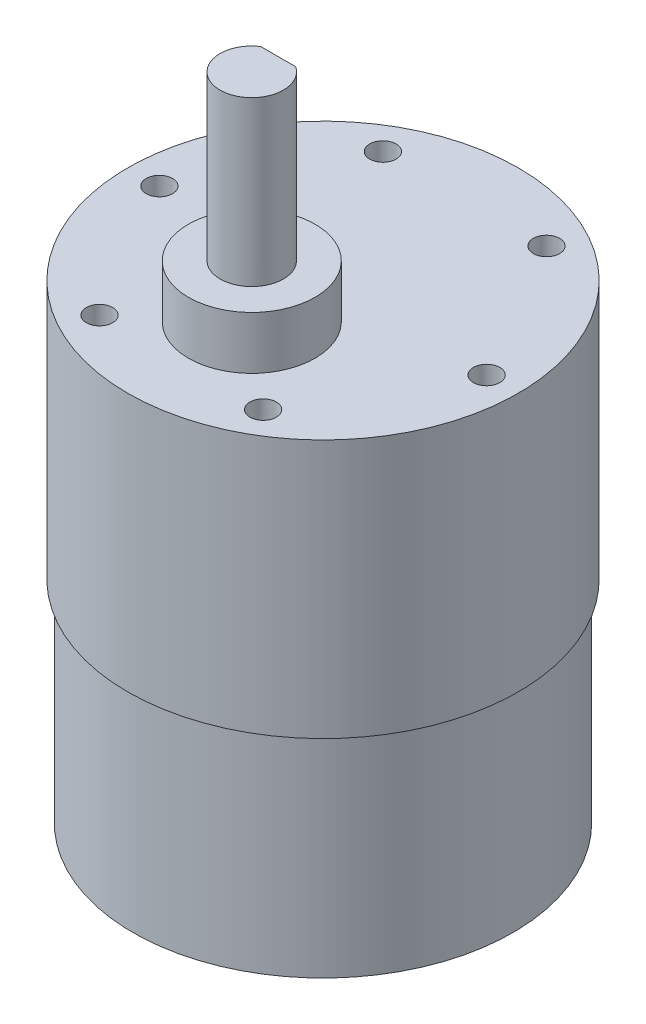
ISO-10303-21;
HEADER;
FILE_DESCRIPTION(('STEP AP214'),'2;1');
FILE_NAME('part.step','',(''),(''),'','','');
FILE_SCHEMA(('AUTOMOTIVE_DESIGN { 1 0 10303 214 1 1 1 1 }'));
ENDSEC;
DATA;
#1=APPLICATION_CONTEXT('core data for automotive mechanical design processes');
#2=APPLICATION_PROTOCOL_DEFINITION('international standard','automotive_design',2000,#1);
#3=PRODUCT_CONTEXT('',#1,'mechanical');
#4=PRODUCT('Part','Part','',(#3));
#5=PRODUCT_RELATED_PRODUCT_CATEGORY('part','',(#4));
#6=PRODUCT_DEFINITION_FORMATION('','',#4);
#7=PRODUCT_DEFINITION_CONTEXT('part definition',#1,'design');
#8=PRODUCT_DEFINITION('design','',#6,#7);
#9=PRODUCT_DEFINITION_SHAPE('','',#8);
#10=(LENGTH_UNIT() NAMED_UNIT(*) SI_UNIT(.MILLI.,.METRE.));
#11=(NAMED_UNIT(*) PLANE_ANGLE_UNIT() SI_UNIT($,.RADIAN.));
#12=(NAMED_UNIT(*) SI_UNIT($,.STERADIAN.) SOLID_ANGLE_UNIT());
#13=UNCERTAINTY_MEASURE_WITH_UNIT(LENGTH_MEASURE(1.E-05),#10,'distance_accuracy_value','');
#14=(GEOMETRIC_REPRESENTATION_CONTEXT(3) GLOBAL_UNCERTAINTY_ASSIGNED_CONTEXT((#13)) GLOBAL_UNIT_ASSIGNED_CONTEXT((#10,
#11,#12)) REPRESENTATION_CONTEXT('',''));
#15=CARTESIAN_POINT('',(0.,0.,0.));
#16=DIRECTION('',(0.,0.,1.));
#17=DIRECTION('',(1.,0.,0.));
#18=AXIS2_PLACEMENT_3D('',#15,#16,#17);
#19=CARTESIAN_POINT('',(0.,-33.9963777433768,0.));
#20=DIRECTION('',(0.,1.,0.));
#21=DIRECTION('',(0.,0.,1.));
#22=AXIS2_PLACEMENT_3D('',#19,#20,#21);
#23=CYLINDRICAL_SURFACE('',#22,18.5);
#24=CARTESIAN_POINT('',(0.,-33.9963777433768,0.));
#25=DIRECTION('',(0.,1.,0.));
#26=DIRECTION('',(0.,0.,1.));
#27=AXIS2_PLACEMENT_3D('',#24,#25,#26);
#28=CIRCLE('',#27,18.5);
#29=CARTESIAN_POINT('',(0.,-33.9963777433768,18.5));
#30=VERTEX_POINT('',#29);
#31=EDGE_CURVE('E11',#30,#30,#28,.T.);
#32=ORIENTED_EDGE('',*,*,#31,.T.);
#33=EDGE_LOOP('',(#32));
#34=FACE_BOUND('',#33,.T.);
#35=CARTESIAN_POINT('',(0.,-9.49637774337678,0.));
#36=DIRECTION('',(0.,1.,0.));
#37=DIRECTION('',(0.,0.,1.));
#38=AXIS2_PLACEMENT_3D('',#35,#36,#37);
#39=CIRCLE('',#38,18.5);
#40=CARTESIAN_POINT('',(0.,-9.49637774337678,18.5));
#41=VERTEX_POINT('',#40);
#42=EDGE_CURVE('E39',#41,#41,#39,.T.);
#43=ORIENTED_EDGE('',*,*,#42,.F.);
#44=EDGE_LOOP('',(#43));
#45=FACE_BOUND('',#44,.T.);
#46=ADVANCED_FACE('F32',(#34,#45),#23,.T.);
#47=CARTESIAN_POINT('',(18.5,-33.9963777433768,0.));
#48=DIRECTION('',(0.,-1.,0.));
#49=DIRECTION('',(0.,0.,-1.));
#50=AXIS2_PLACEMENT_3D('',#47,#48,#49);
#51=PLANE('',#50);
#52=CARTESIAN_POINT('',(0.,-33.9963777433768,0.));
#53=DIRECTION('',(0.,-1.,0.));
#54=DIRECTION('',(0.,0.,-1.));
#55=AXIS2_PLACEMENT_3D('',#52,#53,#54);
#56=CIRCLE('',#55,18.);
#57=CARTESIAN_POINT('',(0.,-33.9963777433768,-18.));
#58=VERTEX_POINT('',#57);
#59=EDGE_CURVE('E123',#58,#58,#56,.T.);
#60=ORIENTED_EDGE('',*,*,#59,.F.);
#61=EDGE_LOOP('',(#60));
#62=FACE_BOUND('',#61,.T.);
#63=ORIENTED_EDGE('',*,*,#31,.F.);
#64=EDGE_LOOP('',(#63));
#65=FACE_BOUND('',#64,.T.);
#66=ADVANCED_FACE('F153',(#62,#65),#51,.T.);
#67=CARTESIAN_POINT('',(0.,-9.49637774337678,0.));
#68=DIRECTION('',(0.,1.,0.));
#69=DIRECTION('',(0.,0.,1.));
#70=AXIS2_PLACEMENT_3D('',#67,#68,#69);
#71=PLANE('',#70);
#72=CARTESIAN_POINT('',(-7.75000000000016,-9.49637774337678,-13.4233937586587));
#73=DIRECTION('',(0.,1.,0.));
#74=DIRECTION('',(0.,0.,1.));
#75=AXIS2_PLACEMENT_3D('',#72,#73,#74);
#76=CIRCLE('',#75,1.24999999999998);
#77=CARTESIAN_POINT('',(-7.75000000000016,-9.49637774337678,-12.1733937586587));
#78=VERTEX_POINT('',#77);
#79=EDGE_CURVE('E89',#78,#78,#76,.T.);
#80=ORIENTED_EDGE('',*,*,#79,.F.);
#81=EDGE_LOOP('',(#80));
#82=FACE_BOUND('',#81,.T.);
#83=CARTESIAN_POINT('',(7.74999999999987,-9.49637774337678,-13.4233937586589));
#84=DIRECTION('',(0.,1.,0.));
#85=DIRECTION('',(0.,0.,1.));
#86=AXIS2_PLACEMENT_3D('',#83,#84,#85);
#87=CIRCLE('',#86,1.24999999999998);
#88=CARTESIAN_POINT('',(7.74999999999987,-9.49637774337678,-12.1733937586589));
#89=VERTEX_POINT('',#88);
#90=EDGE_CURVE('E88',#89,#89,#87,.T.);
#91=ORIENTED_EDGE('',*,*,#90,.F.);
#92=EDGE_LOOP('',(#91));
#93=FACE_BOUND('',#92,.T.);
#94=CARTESIAN_POINT('',(15.5,-9.49637774337678,0.));
#95=DIRECTION('',(0.,1.,0.));
#96=DIRECTION('',(0.,0.,1.));
#97=AXIS2_PLACEMENT_3D('',#94,#95,#96);
#98=CIRCLE('',#97,1.24999999999998);
#99=CARTESIAN_POINT('',(15.5,-9.49637774337678,1.24999999999998));
#100=VERTEX_POINT('',#99);
#101=EDGE_CURVE('E99',#100,#100,#98,.T.);
#102=ORIENTED_EDGE('',*,*,#101,.F.);
#103=EDGE_LOOP('',(#102));
#104=FACE_BOUND('',#103,.T.);
#105=CARTESIAN_POINT('',(7.75000000000006,-9.49637774337678,13.4233937586588));
#106=DIRECTION('',(0.,1.,0.));
#107=DIRECTION('',(0.,0.,1.));
#108=AXIS2_PLACEMENT_3D('',#105,#106,#107);
#109=CIRCLE('',#108,1.24999999999998);
#110=CARTESIAN_POINT('',(7.75000000000006,-9.49637774337678,14.6733937586587));
#111=VERTEX_POINT('',#110);
#112=EDGE_CURVE('E105',#111,#111,#109,.T.);
#113=ORIENTED_EDGE('',*,*,#112,.F.);
#114=EDGE_LOOP('',(#113));
#115=FACE_BOUND('',#114,.T.);
#116=CARTESIAN_POINT('',(-7.74999999999997,-9.49637774337678,13.4233937586588));
#117=DIRECTION('',(0.,1.,0.));
#118=DIRECTION('',(0.,0.,1.));
#119=AXIS2_PLACEMENT_3D('',#116,#117,#118);
#120=CIRCLE('',#119,1.24999999999998);
#121=CARTESIAN_POINT('',(-7.74999999999997,-9.49637774337678,14.6733937586588));
#122=VERTEX_POINT('',#121);
#123=EDGE_CURVE('E111',#122,#122,#120,.T.);
#124=ORIENTED_EDGE('',*,*,#123,.F.);
#125=EDGE_LOOP('',(#124));
#126=FACE_BOUND('',#125,.T.);
#127=CARTESIAN_POINT('',(-15.5,-9.49637774337678,0.));
#128=DIRECTION('',(0.,1.,0.));
#129=DIRECTION('',(0.,0.,1.));
#130=AXIS2_PLACEMENT_3D('',#127,#128,#129);
#131=CIRCLE('',#130,1.24999999999998);
#132=CARTESIAN_POINT('',(-15.5,-9.49637774337678,1.24999999999998));
#133=VERTEX_POINT('',#132);
#134=EDGE_CURVE('E117',#133,#133,#131,.T.);
#135=ORIENTED_EDGE('',*,*,#134,.F.);
#136=EDGE_LOOP('',(#135));
#137=FACE_BOUND('',#136,.T.);
#138=CARTESIAN_POINT('',(0.,-9.49637774337678,6.75));
#139=DIRECTION('',(0.,1.,0.));
#140=DIRECTION('',(0.,0.,1.));
#141=AXIS2_PLACEMENT_3D('',#138,#139,#140);
#142=CIRCLE('',#141,6.00000000000001);
#143=CARTESIAN_POINT('',(0.,-9.49637774337678,12.75));
#144=VERTEX_POINT('',#143);
#145=EDGE_CURVE('E140',#144,#144,#142,.T.);
#146=ORIENTED_EDGE('',*,*,#145,.F.);
#147=EDGE_LOOP('',(#146));
#148=FACE_BOUND('',#147,.T.);
#149=ORIENTED_EDGE('',*,*,#42,.T.);
#150=EDGE_LOOP('',(#149));
#151=FACE_BOUND('',#150,.T.);
#152=ADVANCED_FACE('F150',(#82,#93,#104,#115,#126,#137,#148,#151),#71,.T.);
#153=CARTESIAN_POINT('',(0.,-4.49637774337678,6.75));
#154=DIRECTION('',(0.,-1.,0.));
#155=DIRECTION('',(0.,0.,-1.));
#156=AXIS2_PLACEMENT_3D('',#153,#154,#155);
#157=CYLINDRICAL_SURFACE('',#156,6.00000000000001);
#158=CARTESIAN_POINT('',(0.,-4.49637774337678,6.75));
#159=DIRECTION('',(0.,1.,0.));
#160=DIRECTION('',(0.,0.,1.));
#161=AXIS2_PLACEMENT_3D('',#158,#159,#160);
#162=CIRCLE('',#161,6.00000000000001);
#163=CARTESIAN_POINT('',(0.,-4.49637774337678,12.75));
#164=VERTEX_POINT('',#163);
#165=EDGE_CURVE('E143',#164,#164,#162,.T.);
#166=ORIENTED_EDGE('',*,*,#165,.F.);
#167=EDGE_LOOP('',(#166));
#168=FACE_BOUND('',#167,.T.);
#169=ORIENTED_EDGE('',*,*,#145,.T.);
#170=EDGE_LOOP('',(#169));
#171=FACE_BOUND('',#170,.T.);
#172=ADVANCED_FACE('F164',(#168,#171),#157,.T.);
#173=CARTESIAN_POINT('',(0.,-4.49637774337678,6.75));
#174=DIRECTION('',(0.,1.,0.));
#175=DIRECTION('',(0.,0.,1.));
#176=AXIS2_PLACEMENT_3D('',#173,#174,#175);
#177=PLANE('',#176);
#178=CARTESIAN_POINT('',(0.,-4.49637774337678,6.75));
#179=DIRECTION('',(0.,1.,0.));
#180=DIRECTION('',(0.,0.,1.));
#181=AXIS2_PLACEMENT_3D('',#178,#179,#180);
#182=CIRCLE('',#181,3.00000000000001);
#183=CARTESIAN_POINT('',(0.,-4.49637774337678,9.75000000000001));
#184=VERTEX_POINT('',#183);
#185=EDGE_CURVE('E135',#184,#184,#182,.T.);
#186=ORIENTED_EDGE('',*,*,#185,.F.);
#187=EDGE_LOOP('',(#186));
#188=FACE_BOUND('',#187,.T.);
#189=ORIENTED_EDGE('',*,*,#165,.T.);
#190=EDGE_LOOP('',(#189));
#191=FACE_BOUND('',#190,.T.);
#192=ADVANCED_FACE('F171',(#188,#191),#177,.T.);
#193=CARTESIAN_POINT('',(0.,11.0036222566232,6.75));
#194=DIRECTION('',(0.,-1.,0.));
#195=DIRECTION('',(0.,0.,-1.));
#196=AXIS2_PLACEMENT_3D('',#193,#194,#195);
#197=CYLINDRICAL_SURFACE('',#196,3.00000000000001);
#198=CARTESIAN_POINT('',(0.,11.0036222566232,6.75));
#199=DIRECTION('',(0.,1.,0.));
#200=DIRECTION('',(0.,0.,1.));
#201=AXIS2_PLACEMENT_3D('',#198,#199,#200);
#202=CIRCLE('',#201,3.00000000000001);
#203=CARTESIAN_POINT('',(-1.65831239517773,11.0036222566232,4.25));
#204=VERTEX_POINT('',#203);
#205=CARTESIAN_POINT('',(1.65831239517772,11.0036222566232,4.25));
#206=VERTEX_POINT('',#205);
#207=EDGE_CURVE('E137',#204,#206,#202,.T.);
#208=ORIENTED_EDGE('',*,*,#207,.F.);
#209=DIRECTION('',(0.,1.,0.));
#210=VECTOR('',#209,1.);
#211=CARTESIAN_POINT('',(-1.65831239517773,-2.99637774337678,4.25));
#212=LINE('',#211,#210);
#213=CARTESIAN_POINT('',(-1.65831239517773,-2.99637774337678,4.25));
#214=VERTEX_POINT('',#213);
#215=EDGE_CURVE('E46',#214,#204,#212,.T.);
#216=ORIENTED_EDGE('',*,*,#215,.F.);
#217=CARTESIAN_POINT('',(0.,-2.99637774337678,6.75));
#218=DIRECTION('',(0.,1.,0.));
#219=DIRECTION('',(0.,0.,1.));
#220=AXIS2_PLACEMENT_3D('',#217,#218,#219);
#221=CIRCLE('',#220,3.00000000000001);
#222=CARTESIAN_POINT('',(1.65831239517772,-2.99637774337678,4.25));
#223=VERTEX_POINT('',#222);
#224=EDGE_CURVE('E129',#223,#214,#221,.T.);
#225=ORIENTED_EDGE('',*,*,#224,.F.);
#226=DIRECTION('',(0.,1.,0.));
#227=VECTOR('',#226,1.);
#228=CARTESIAN_POINT('',(1.65831239517772,-2.99637774337678,4.25));
#229=LINE('',#228,#227);
#230=EDGE_CURVE('E52',#223,#206,#229,.T.);
#231=ORIENTED_EDGE('',*,*,#230,.T.);
#232=EDGE_LOOP('',(#208,#216,#225,#231));
#233=FACE_BOUND('',#232,.T.);
#234=ORIENTED_EDGE('',*,*,#185,.T.);
#235=EDGE_LOOP('',(#234));
#236=FACE_BOUND('',#235,.T.);
#237=ADVANCED_FACE('F175',(#233,#236),#197,.T.);
#238=CARTESIAN_POINT('',(0.,11.0036222566232,6.75));
#239=DIRECTION('',(0.,1.,0.));
#240=DIRECTION('',(0.,0.,1.));
#241=AXIS2_PLACEMENT_3D('',#238,#239,#240);
#242=PLANE('',#241);
#243=DIRECTION('',(1.,0.,0.));
#244=VECTOR('',#243,1.);
#245=CARTESIAN_POINT('',(-1.65831239517773,11.0036222566232,4.25));
#246=LINE('',#245,#244);
#247=EDGE_CURVE('E59',#204,#206,#246,.T.);
#248=ORIENTED_EDGE('',*,*,#247,.F.);
#249=ORIENTED_EDGE('',*,*,#207,.T.);
#250=EDGE_LOOP('',(#248,#249));
#251=FACE_BOUND('',#250,.T.);
#252=ADVANCED_FACE('F179',(#251),#242,.T.);
#253=CARTESIAN_POINT('',(-1.65831239517773,-2.99637774337678,4.25));
#254=DIRECTION('',(0.,0.,1.));
#255=DIRECTION('',(1.,0.,0.));
#256=AXIS2_PLACEMENT_3D('',#253,#254,#255);
#257=PLANE('',#256);
#258=ORIENTED_EDGE('',*,*,#247,.T.);
#259=ORIENTED_EDGE('',*,*,#230,.F.);
#260=DIRECTION('',(1.,0.,0.));
#261=VECTOR('',#260,1.);
#262=CARTESIAN_POINT('',(-1.65831239517773,-2.99637774337678,4.25));
#263=LINE('',#262,#261);
#264=EDGE_CURVE('E131',#214,#223,#263,.T.);
#265=ORIENTED_EDGE('',*,*,#264,.F.);
#266=ORIENTED_EDGE('',*,*,#215,.T.);
#267=EDGE_LOOP('',(#258,#259,#265,#266));
#268=FACE_BOUND('',#267,.T.);
#269=ADVANCED_FACE('F183',(#268),#257,.F.);
#270=CARTESIAN_POINT('',(0.,-2.99637774337678,6.75));
#271=DIRECTION('',(0.,1.,0.));
#272=DIRECTION('',(0.,0.,1.));
#273=AXIS2_PLACEMENT_3D('',#270,#271,#272);
#274=PLANE('',#273);
#275=ORIENTED_EDGE('',*,*,#224,.T.);
#276=ORIENTED_EDGE('',*,*,#264,.T.);
#277=EDGE_LOOP('',(#275,#276));
#278=FACE_BOUND('',#277,.T.);
#279=ADVANCED_FACE('F187',(#278),#274,.T.);
#280=CARTESIAN_POINT('',(0.,-53.9963777433768,0.));
#281=DIRECTION('',(0.,1.,0.));
#282=DIRECTION('',(0.,0.,1.));
#283=AXIS2_PLACEMENT_3D('',#280,#281,#282);
#284=CYLINDRICAL_SURFACE('',#283,18.);
#285=CARTESIAN_POINT('',(0.,-53.9963777433768,0.));
#286=DIRECTION('',(0.,-1.,0.));
#287=DIRECTION('',(0.,0.,-1.));
#288=AXIS2_PLACEMENT_3D('',#285,#286,#287);
#289=CIRCLE('',#288,18.);
#290=CARTESIAN_POINT('',(0.,-53.9963777433768,-18.));
#291=VERTEX_POINT('',#290);
#292=EDGE_CURVE('E124',#291,#291,#289,.T.);
#293=ORIENTED_EDGE('',*,*,#292,.F.);
#294=EDGE_LOOP('',(#293));
#295=FACE_BOUND('',#294,.T.);
#296=ORIENTED_EDGE('',*,*,#59,.T.);
#297=EDGE_LOOP('',(#296));
#298=FACE_BOUND('',#297,.T.);
#299=ADVANCED_FACE('F190',(#295,#298),#284,.T.);
#300=CARTESIAN_POINT('',(0.,-53.9963777433768,0.));
#301=DIRECTION('',(0.,-1.,0.));
#302=DIRECTION('',(0.,0.,-1.));
#303=AXIS2_PLACEMENT_3D('',#300,#301,#302);
#304=PLANE('',#303);
#305=ORIENTED_EDGE('',*,*,#292,.T.);
#306=EDGE_LOOP('',(#305));
#307=FACE_BOUND('',#306,.T.);
#308=ADVANCED_FACE('F194',(#307),#304,.T.);
#309=CARTESIAN_POINT('',(-15.5,-17.9963777433768,0.));
#310=DIRECTION('',(0.,1.,0.));
#311=DIRECTION('',(0.,0.,1.));
#312=AXIS2_PLACEMENT_3D('',#309,#310,#311);
#313=CONICAL_SURFACE('',#312,1.24999999999998,1.02974425867296);
#314=CARTESIAN_POINT('',(-15.5,-18.7474535171675,0.));
#315=VERTEX_POINT('',#314);
#316=VERTEX_LOOP('',#315);
#317=FACE_BOUND('',#316,.T.);
#318=CARTESIAN_POINT('',(-15.5,-17.9963777433768,0.));
#319=DIRECTION('',(0.,1.,0.));
#320=DIRECTION('',(0.,0.,1.));
#321=AXIS2_PLACEMENT_3D('',#318,#319,#320);
#322=CIRCLE('',#321,1.24999999999998);
#323=CARTESIAN_POINT('',(-15.5,-17.9963777433768,1.24999999999998));
#324=VERTEX_POINT('',#323);
#325=EDGE_CURVE('E120',#324,#324,#322,.T.);
#326=ORIENTED_EDGE('',*,*,#325,.T.);
#327=EDGE_LOOP('',(#326));
#328=FACE_BOUND('',#327,.T.);
#329=ADVANCED_FACE('F198',(#317,#328),#313,.F.);
#330=CARTESIAN_POINT('',(-15.5,-9.49637774337678,0.));
#331=DIRECTION('',(0.,1.,0.));
#332=DIRECTION('',(0.,0.,1.));
#333=AXIS2_PLACEMENT_3D('',#330,#331,#332);
#334=CYLINDRICAL_SURFACE('',#333,1.24999999999998);
#335=ORIENTED_EDGE('',*,*,#325,.F.);
#336=EDGE_LOOP('',(#335));
#337=FACE_BOUND('',#336,.T.);
#338=ORIENTED_EDGE('',*,*,#134,.T.);
#339=EDGE_LOOP('',(#338));
#340=FACE_BOUND('',#339,.T.);
#341=ADVANCED_FACE('F202',(#337,#340),#334,.F.);
#342=CARTESIAN_POINT('',(-7.74999999999997,-17.9963777433768,13.4233937586588));
#343=DIRECTION('',(0.,1.,0.));
#344=DIRECTION('',(0.,0.,1.));
#345=AXIS2_PLACEMENT_3D('',#342,#343,#344);
#346=CONICAL_SURFACE('',#345,1.24999999999998,1.02974425867296);
#347=CARTESIAN_POINT('',(-7.74999999999997,-18.7474535171675,13.4233937586588));
#348=VERTEX_POINT('',#347);
#349=VERTEX_LOOP('',#348);
#350=FACE_BOUND('',#349,.T.);
#351=CARTESIAN_POINT('',(-7.74999999999997,-17.9963777433768,13.4233937586588));
#352=DIRECTION('',(0.,1.,0.));
#353=DIRECTION('',(0.,0.,1.));
#354=AXIS2_PLACEMENT_3D('',#351,#352,#353);
#355=CIRCLE('',#354,1.24999999999998);
#356=CARTESIAN_POINT('',(-7.74999999999997,-17.9963777433768,14.6733937586588));
#357=VERTEX_POINT('',#356);
#358=EDGE_CURVE('E114',#357,#357,#355,.T.);
#359=ORIENTED_EDGE('',*,*,#358,.T.);
#360=EDGE_LOOP('',(#359));
#361=FACE_BOUND('',#360,.T.);
#362=ADVANCED_FACE('F205',(#350,#361),#346,.F.);
#363=CARTESIAN_POINT('',(-7.74999999999997,-9.49637774337678,13.4233937586588));
#364=DIRECTION('',(0.,1.,0.));
#365=DIRECTION('',(0.,0.,1.));
#366=AXIS2_PLACEMENT_3D('',#363,#364,#365);
#367=CYLINDRICAL_SURFACE('',#366,1.24999999999998);
#368=ORIENTED_EDGE('',*,*,#358,.F.);
#369=EDGE_LOOP('',(#368));
#370=FACE_BOUND('',#369,.T.);
#371=ORIENTED_EDGE('',*,*,#123,.T.);
#372=EDGE_LOOP('',(#371));
#373=FACE_BOUND('',#372,.T.);
#374=ADVANCED_FACE('F209',(#370,#373),#367,.F.);
#375=CARTESIAN_POINT('',(7.75000000000006,-17.9963777433768,13.4233937586588));
#376=DIRECTION('',(0.,1.,0.));
#377=DIRECTION('',(0.,0.,1.));
#378=AXIS2_PLACEMENT_3D('',#375,#376,#377);
#379=CONICAL_SURFACE('',#378,1.24999999999998,1.02974425867296);
#380=CARTESIAN_POINT('',(7.75000000000006,-18.7474535171675,13.4233937586588));
#381=VERTEX_POINT('',#380);
#382=VERTEX_LOOP('',#381);
#383=FACE_BOUND('',#382,.T.);
#384=CARTESIAN_POINT('',(7.75000000000006,-17.9963777433768,13.4233937586588));
#385=DIRECTION('',(0.,1.,0.));
#386=DIRECTION('',(0.,0.,1.));
#387=AXIS2_PLACEMENT_3D('',#384,#385,#386);
#388=CIRCLE('',#387,1.24999999999998);
#389=CARTESIAN_POINT('',(7.75000000000006,-17.9963777433768,14.6733937586587));
#390=VERTEX_POINT('',#389);
#391=EDGE_CURVE('E108',#390,#390,#388,.T.);
#392=ORIENTED_EDGE('',*,*,#391,.T.);
#393=EDGE_LOOP('',(#392));
#394=FACE_BOUND('',#393,.T.);
#395=ADVANCED_FACE('F213',(#383,#394),#379,.F.);
#396=CARTESIAN_POINT('',(7.75000000000006,-9.49637774337678,13.4233937586588));
#397=DIRECTION('',(0.,1.,0.));
#398=DIRECTION('',(0.,0.,1.));
#399=AXIS2_PLACEMENT_3D('',#396,#397,#398);
#400=CYLINDRICAL_SURFACE('',#399,1.24999999999998);
#401=ORIENTED_EDGE('',*,*,#391,.F.);
#402=EDGE_LOOP('',(#401));
#403=FACE_BOUND('',#402,.T.);
#404=ORIENTED_EDGE('',*,*,#112,.T.);
#405=EDGE_LOOP('',(#404));
#406=FACE_BOUND('',#405,.T.);
#407=ADVANCED_FACE('F217',(#403,#406),#400,.F.);
#408=CARTESIAN_POINT('',(15.5,-17.9963777433768,0.));
#409=DIRECTION('',(0.,1.,0.));
#410=DIRECTION('',(0.,0.,1.));
#411=AXIS2_PLACEMENT_3D('',#408,#409,#410);
#412=CONICAL_SURFACE('',#411,1.24999999999998,1.02974425867296);
#413=CARTESIAN_POINT('',(15.5,-18.7474535171675,0.));
#414=VERTEX_POINT('',#413);
#415=VERTEX_LOOP('',#414);
#416=FACE_BOUND('',#415,.T.);
#417=CARTESIAN_POINT('',(15.5,-17.9963777433768,0.));
#418=DIRECTION('',(0.,1.,0.));
#419=DIRECTION('',(0.,0.,1.));
#420=AXIS2_PLACEMENT_3D('',#417,#418,#419);
#421=CIRCLE('',#420,1.24999999999998);
#422=CARTESIAN_POINT('',(15.5,-17.9963777433768,1.24999999999998));
#423=VERTEX_POINT('',#422);
#424=EDGE_CURVE('E102',#423,#423,#421,.T.);
#425=ORIENTED_EDGE('',*,*,#424,.T.);
#426=EDGE_LOOP('',(#425));
#427=FACE_BOUND('',#426,.T.);
#428=ADVANCED_FACE('F221',(#416,#427),#412,.F.);
#429=CARTESIAN_POINT('',(15.5,-9.49637774337678,0.));
#430=DIRECTION('',(0.,1.,0.));
#431=DIRECTION('',(0.,0.,1.));
#432=AXIS2_PLACEMENT_3D('',#429,#430,#431);
#433=CYLINDRICAL_SURFACE('',#432,1.24999999999998);
#434=ORIENTED_EDGE('',*,*,#424,.F.);
#435=EDGE_LOOP('',(#434));
#436=FACE_BOUND('',#435,.T.);
#437=ORIENTED_EDGE('',*,*,#101,.T.);
#438=EDGE_LOOP('',(#437));
#439=FACE_BOUND('',#438,.T.);
#440=ADVANCED_FACE('F225',(#436,#439),#433,.F.);
#441=CARTESIAN_POINT('',(7.74999999999987,-17.9963777433768,-13.4233937586589));
#442=DIRECTION('',(0.,1.,0.));
#443=DIRECTION('',(0.,0.,1.));
#444=AXIS2_PLACEMENT_3D('',#441,#442,#443);
#445=CONICAL_SURFACE('',#444,1.24999999999998,1.02974425867296);
#446=CARTESIAN_POINT('',(7.74999999999987,-18.7474535171675,-13.4233937586589));
#447=VERTEX_POINT('',#446);
#448=VERTEX_LOOP('',#447);
#449=FACE_BOUND('',#448,.T.);
#450=CARTESIAN_POINT('',(7.74999999999987,-17.9963777433768,-13.4233937586589));
#451=DIRECTION('',(0.,1.,0.));
#452=DIRECTION('',(0.,0.,1.));
#453=AXIS2_PLACEMENT_3D('',#450,#451,#452);
#454=CIRCLE('',#453,1.24999999999998);
#455=CARTESIAN_POINT('',(7.74999999999987,-17.9963777433768,-12.1733937586589));
#456=VERTEX_POINT('',#455);
#457=EDGE_CURVE('E92',#456,#456,#454,.T.);
#458=ORIENTED_EDGE('',*,*,#457,.T.);
#459=EDGE_LOOP('',(#458));
#460=FACE_BOUND('',#459,.T.);
#461=ADVANCED_FACE('F229',(#449,#460),#445,.F.);
#462=CARTESIAN_POINT('',(7.74999999999987,-9.49637774337678,-13.4233937586589));
#463=DIRECTION('',(0.,1.,0.));
#464=DIRECTION('',(0.,0.,1.));
#465=AXIS2_PLACEMENT_3D('',#462,#463,#464);
#466=CYLINDRICAL_SURFACE('',#465,1.24999999999998);
#467=ORIENTED_EDGE('',*,*,#457,.F.);
#468=EDGE_LOOP('',(#467));
#469=FACE_BOUND('',#468,.T.);
#470=ORIENTED_EDGE('',*,*,#90,.T.);
#471=EDGE_LOOP('',(#470));
#472=FACE_BOUND('',#471,.T.);
#473=ADVANCED_FACE('F82',(#469,#472),#466,.F.);
#474=CARTESIAN_POINT('',(-7.75000000000016,-17.9963777433768,-13.4233937586587));
#475=DIRECTION('',(0.,1.,0.));
#476=DIRECTION('',(0.,0.,1.));
#477=AXIS2_PLACEMENT_3D('',#474,#475,#476);
#478=CONICAL_SURFACE('',#477,1.24999999999998,1.02974425867296);
#479=CARTESIAN_POINT('',(-7.75000000000016,-18.7474535171675,-13.4233937586587));
#480=VERTEX_POINT('',#479);
#481=VERTEX_LOOP('',#480);
#482=FACE_BOUND('',#481,.T.);
#483=CARTESIAN_POINT('',(-7.75000000000016,-17.9963777433768,-13.4233937586587));
#484=DIRECTION('',(0.,1.,0.));
#485=DIRECTION('',(0.,0.,1.));
#486=AXIS2_PLACEMENT_3D('',#483,#484,#485);
#487=CIRCLE('',#486,1.24999999999998);
#488=CARTESIAN_POINT('',(-7.75000000000016,-17.9963777433768,-12.1733937586587));
#489=VERTEX_POINT('',#488);
#490=EDGE_CURVE('E86',#489,#489,#487,.T.);
#491=ORIENTED_EDGE('',*,*,#490,.T.);
#492=EDGE_LOOP('',(#491));
#493=FACE_BOUND('',#492,.T.);
#494=ADVANCED_FACE('F78',(#482,#493),#478,.F.);
#495=CARTESIAN_POINT('',(-7.75000000000016,-9.49637774337678,-13.4233937586587));
#496=DIRECTION('',(0.,1.,0.));
#497=DIRECTION('',(0.,0.,1.));
#498=AXIS2_PLACEMENT_3D('',#495,#496,#497);
#499=CYLINDRICAL_SURFACE('',#498,1.24999999999998);
#500=ORIENTED_EDGE('',*,*,#490,.F.);
#501=EDGE_LOOP('',(#500));
#502=FACE_BOUND('',#501,.T.);
#503=ORIENTED_EDGE('',*,*,#79,.T.);
#504=EDGE_LOOP('',(#503));
#505=FACE_BOUND('',#504,.T.);
#506=ADVANCED_FACE('F81',(#502,#505),#499,.F.);
#507=CLOSED_SHELL('',(#46,#66,#152,#172,#192,#237,#252,#269,#279,#299,#308,#329,#341,#362,#374,
#395,#407,#428,#440,#461,#473,#494,#506));
#508=MANIFOLD_SOLID_BREP('B2',#507);
#509=ADVANCED_BREP_SHAPE_REPRESENTATION('',(#18,#508),#14);
#510=SHAPE_DEFINITION_REPRESENTATION(#9,#509);
ENDSEC;
END-ISO-10303-21;
